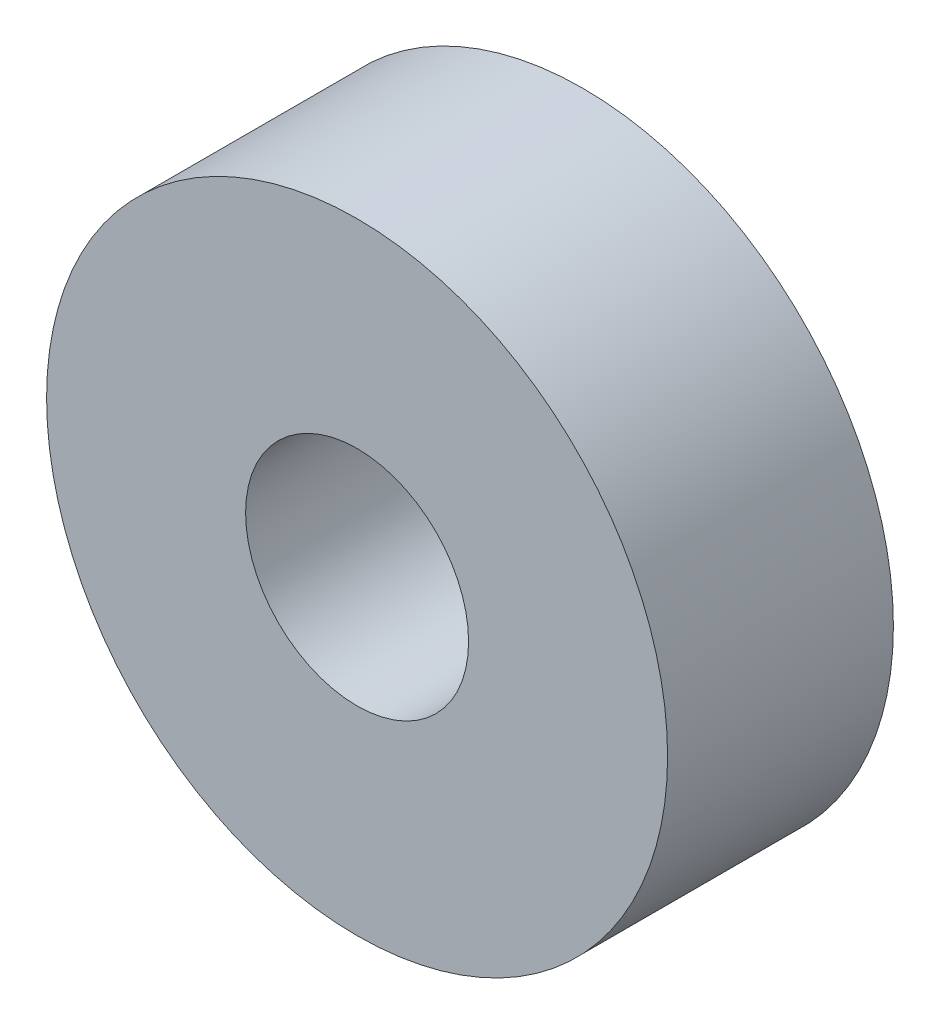
ISO-10303-21;
HEADER;
FILE_DESCRIPTION(('STEP AP214'),'2;1');
FILE_NAME('part.step','',(''),(''),'','','');
FILE_SCHEMA(('AUTOMOTIVE_DESIGN { 1 0 10303 214 1 1 1 1 }'));
ENDSEC;
DATA;
#1=APPLICATION_CONTEXT('core data for automotive mechanical design processes');
#2=APPLICATION_PROTOCOL_DEFINITION('international standard','automotive_design',2000,#1);
#3=PRODUCT_CONTEXT('',#1,'mechanical');
#4=PRODUCT('Part','Part','',(#3));
#5=PRODUCT_RELATED_PRODUCT_CATEGORY('part','',(#4));
#6=PRODUCT_DEFINITION_FORMATION('','',#4);
#7=PRODUCT_DEFINITION_CONTEXT('part definition',#1,'design');
#8=PRODUCT_DEFINITION('design','',#6,#7);
#9=PRODUCT_DEFINITION_SHAPE('','',#8);
#10=(LENGTH_UNIT() NAMED_UNIT(*) SI_UNIT(.MILLI.,.METRE.));
#11=(NAMED_UNIT(*) PLANE_ANGLE_UNIT() SI_UNIT($,.RADIAN.));
#12=(NAMED_UNIT(*) SI_UNIT($,.STERADIAN.) SOLID_ANGLE_UNIT());
#13=UNCERTAINTY_MEASURE_WITH_UNIT(LENGTH_MEASURE(1.E-05),#10,'distance_accuracy_value','');
#14=(GEOMETRIC_REPRESENTATION_CONTEXT(3) GLOBAL_UNCERTAINTY_ASSIGNED_CONTEXT((#13)) GLOBAL_UNIT_ASSIGNED_CONTEXT((#10,
#11,#12)) REPRESENTATION_CONTEXT('',''));
#15=CARTESIAN_POINT('',(0.,0.,0.));
#16=DIRECTION('',(0.,0.,1.));
#17=DIRECTION('',(1.,0.,0.));
#18=AXIS2_PLACEMENT_3D('',#15,#16,#17);
#19=CARTESIAN_POINT('',(0.,0.,8.));
#20=DIRECTION('',(0.,0.,1.));
#21=DIRECTION('',(1.,0.,0.));
#22=AXIS2_PLACEMENT_3D('',#19,#20,#21);
#23=PLANE('',#22);
#24=CARTESIAN_POINT('',(0.,0.,8.));
#25=DIRECTION('',(0.,0.,1.));
#26=DIRECTION('',(1.,0.,0.));
#27=AXIS2_PLACEMENT_3D('',#24,#25,#26);
#28=CIRCLE('',#27,11.);
#29=CARTESIAN_POINT('',(11.,0.,8.));
#30=VERTEX_POINT('',#29);
#31=EDGE_CURVE('E11',#30,#30,#28,.T.);
#32=ORIENTED_EDGE('',*,*,#31,.T.);
#33=EDGE_LOOP('',(#32));
#34=FACE_BOUND('',#33,.T.);
#35=CARTESIAN_POINT('',(0.,0.,8.));
#36=DIRECTION('',(0.,0.,1.));
#37=DIRECTION('',(1.,0.,0.));
#38=AXIS2_PLACEMENT_3D('',#35,#36,#37);
#39=CIRCLE('',#38,3.95);
#40=CARTESIAN_POINT('',(3.95,0.,8.));
#41=VERTEX_POINT('',#40);
#42=EDGE_CURVE('E55',#41,#41,#39,.T.);
#43=ORIENTED_EDGE('',*,*,#42,.F.);
#44=EDGE_LOOP('',(#43));
#45=FACE_BOUND('',#44,.T.);
#46=ADVANCED_FACE('F39',(#34,#45),#23,.T.);
#47=CARTESIAN_POINT('',(0.,0.,0.));
#48=DIRECTION('',(0.,0.,1.));
#49=DIRECTION('',(1.,0.,0.));
#50=AXIS2_PLACEMENT_3D('',#47,#48,#49);
#51=PLANE('',#50);
#52=CARTESIAN_POINT('',(0.,0.,0.));
#53=DIRECTION('',(0.,0.,1.));
#54=DIRECTION('',(1.,0.,0.));
#55=AXIS2_PLACEMENT_3D('',#52,#53,#54);
#56=CIRCLE('',#55,11.);
#57=CARTESIAN_POINT('',(11.,0.,0.));
#58=VERTEX_POINT('',#57);
#59=EDGE_CURVE('E44',#58,#58,#56,.T.);
#60=ORIENTED_EDGE('',*,*,#59,.F.);
#61=EDGE_LOOP('',(#60));
#62=FACE_BOUND('',#61,.T.);
#63=CARTESIAN_POINT('',(0.,0.,0.));
#64=DIRECTION('',(0.,0.,1.));
#65=DIRECTION('',(1.,0.,0.));
#66=AXIS2_PLACEMENT_3D('',#63,#64,#65);
#67=CIRCLE('',#66,3.95);
#68=CARTESIAN_POINT('',(3.95,0.,0.));
#69=VERTEX_POINT('',#68);
#70=EDGE_CURVE('E57',#69,#69,#67,.T.);
#71=ORIENTED_EDGE('',*,*,#70,.T.);
#72=EDGE_LOOP('',(#71));
#73=FACE_BOUND('',#72,.T.);
#74=ADVANCED_FACE('F70',(#62,#73),#51,.F.);
#75=CARTESIAN_POINT('',(0.,0.,8.));
#76=DIRECTION('',(0.,0.,-1.));
#77=DIRECTION('',(-1.,0.,0.));
#78=AXIS2_PLACEMENT_3D('',#75,#76,#77);
#79=CYLINDRICAL_SURFACE('',#78,11.);
#80=ORIENTED_EDGE('',*,*,#31,.F.);
#81=EDGE_LOOP('',(#80));
#82=FACE_BOUND('',#81,.T.);
#83=ORIENTED_EDGE('',*,*,#59,.T.);
#84=EDGE_LOOP('',(#83));
#85=FACE_BOUND('',#84,.T.);
#86=ADVANCED_FACE('F42',(#82,#85),#79,.T.);
#87=CARTESIAN_POINT('',(0.,0.,8.));
#88=DIRECTION('',(0.,0.,-1.));
#89=DIRECTION('',(-1.,0.,0.));
#90=AXIS2_PLACEMENT_3D('',#87,#88,#89);
#91=CYLINDRICAL_SURFACE('',#90,3.95);
#92=ORIENTED_EDGE('',*,*,#42,.T.);
#93=EDGE_LOOP('',(#92));
#94=FACE_BOUND('',#93,.T.);
#95=ORIENTED_EDGE('',*,*,#70,.F.);
#96=EDGE_LOOP('',(#95));
#97=FACE_BOUND('',#96,.T.);
#98=ADVANCED_FACE('F72',(#94,#97),#91,.F.);
#99=CLOSED_SHELL('',(#46,#74,#86,#98));
#100=MANIFOLD_SOLID_BREP('B2',#99);
#101=ADVANCED_BREP_SHAPE_REPRESENTATION('',(#18,#100),#14);
#102=SHAPE_DEFINITION_REPRESENTATION(#9,#101);
ENDSEC;
END-ISO-10303-21;
